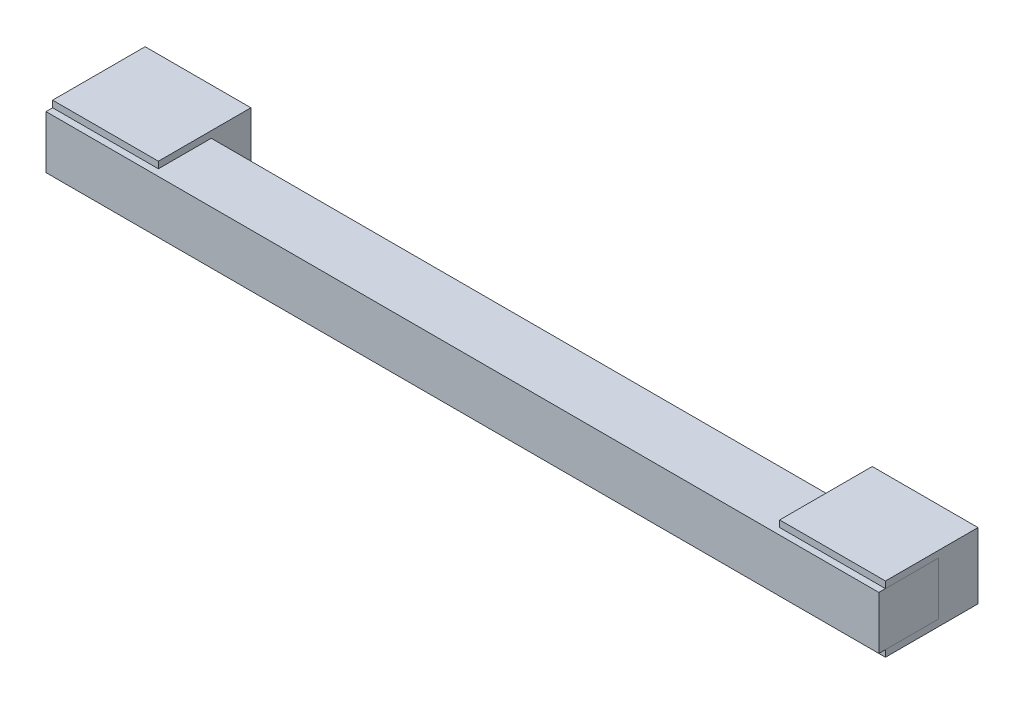
ISO-10303-21;
HEADER;
FILE_DESCRIPTION(('STEP AP214'),'2;1');
FILE_NAME('part.step','',(''),(''),'','','');
FILE_SCHEMA(('AUTOMOTIVE_DESIGN { 1 0 10303 214 1 1 1 1 }'));
ENDSEC;
DATA;
#1=APPLICATION_CONTEXT('core data for automotive mechanical design processes');
#2=APPLICATION_PROTOCOL_DEFINITION('international standard','automotive_design',2000,#1);
#3=PRODUCT_CONTEXT('',#1,'mechanical');
#4=PRODUCT('Part','Part','',(#3));
#5=PRODUCT_RELATED_PRODUCT_CATEGORY('part','',(#4));
#6=PRODUCT_DEFINITION_FORMATION('','',#4);
#7=PRODUCT_DEFINITION_CONTEXT('part definition',#1,'design');
#8=PRODUCT_DEFINITION('design','',#6,#7);
#9=PRODUCT_DEFINITION_SHAPE('','',#8);
#10=(LENGTH_UNIT() NAMED_UNIT(*) SI_UNIT(.MILLI.,.METRE.));
#11=(NAMED_UNIT(*) PLANE_ANGLE_UNIT() SI_UNIT($,.RADIAN.));
#12=(NAMED_UNIT(*) SI_UNIT($,.STERADIAN.) SOLID_ANGLE_UNIT());
#13=UNCERTAINTY_MEASURE_WITH_UNIT(LENGTH_MEASURE(1.E-05),#10,'distance_accuracy_value','');
#14=(GEOMETRIC_REPRESENTATION_CONTEXT(3) GLOBAL_UNCERTAINTY_ASSIGNED_CONTEXT((#13)) GLOBAL_UNIT_ASSIGNED_CONTEXT((#10,
#11,#12)) REPRESENTATION_CONTEXT('',''));
#15=CARTESIAN_POINT('',(0.,0.,0.));
#16=DIRECTION('',(0.,0.,1.));
#17=DIRECTION('',(1.,0.,0.));
#18=AXIS2_PLACEMENT_3D('',#15,#16,#17);
#19=CARTESIAN_POINT('',(0.,0.,15.));
#20=DIRECTION('',(0.,0.,1.));
#21=DIRECTION('',(1.,0.,0.));
#22=AXIS2_PLACEMENT_3D('',#19,#20,#21);
#23=PLANE('',#22);
#24=DIRECTION('',(-1.,0.,0.));
#25=VECTOR('',#24,1.);
#26=CARTESIAN_POINT('',(0.,-4.,15.));
#27=LINE('',#26,#25);
#28=CARTESIAN_POINT('',(63.,-4.,15.));
#29=VERTEX_POINT('',#28);
#30=CARTESIAN_POINT('',(-63.,-4.,15.));
#31=VERTEX_POINT('',#30);
#32=EDGE_CURVE('P0_E11',#29,#31,#27,.T.);
#33=ORIENTED_EDGE('',*,*,#32,.F.);
#34=DIRECTION('',(0.,-1.,0.));
#35=VECTOR('',#34,1.);
#36=CARTESIAN_POINT('',(63.,0.,15.));
#37=LINE('',#36,#35);
#38=CARTESIAN_POINT('',(63.,4.,15.));
#39=VERTEX_POINT('',#38);
#40=EDGE_CURVE('P0_E62',#39,#29,#37,.T.);
#41=ORIENTED_EDGE('',*,*,#40,.F.);
#42=DIRECTION('',(1.,0.,0.));
#43=VECTOR('',#42,1.);
#44=CARTESIAN_POINT('',(0.,4.,15.));
#45=LINE('',#44,#43);
#46=CARTESIAN_POINT('',(-63.,4.,15.));
#47=VERTEX_POINT('',#46);
#48=EDGE_CURVE('P0_E98',#47,#39,#45,.T.);
#49=ORIENTED_EDGE('',*,*,#48,.F.);
#50=DIRECTION('',(0.,1.,0.));
#51=VECTOR('',#50,1.);
#52=CARTESIAN_POINT('',(-63.,0.,15.));
#53=LINE('',#52,#51);
#54=EDGE_CURVE('P0_E25',#31,#47,#53,.T.);
#55=ORIENTED_EDGE('',*,*,#54,.F.);
#56=EDGE_LOOP('',(#33,#41,#49,#55));
#57=FACE_BOUND('',#56,.T.);
#58=ADVANCED_FACE('P0_F17',(#57),#23,.T.);
#59=CARTESIAN_POINT('',(0.,-4.,6.));
#60=DIRECTION('',(0.,-1.,0.));
#61=DIRECTION('',(0.,0.,-1.));
#62=AXIS2_PLACEMENT_3D('',#59,#60,#61);
#63=PLANE('',#62);
#64=DIRECTION('',(0.,0.,1.));
#65=VECTOR('',#64,1.);
#66=CARTESIAN_POINT('',(63.,-4.,6.));
#67=LINE('',#66,#65);
#68=CARTESIAN_POINT('',(63.,-4.,6.));
#69=VERTEX_POINT('',#68);
#70=EDGE_CURVE('P0_E55',#69,#29,#67,.T.);
#71=ORIENTED_EDGE('',*,*,#70,.T.);
#72=ORIENTED_EDGE('',*,*,#32,.T.);
#73=DIRECTION('',(0.,0.,1.));
#74=VECTOR('',#73,1.);
#75=CARTESIAN_POINT('',(-63.,-4.,6.));
#76=LINE('',#75,#74);
#77=CARTESIAN_POINT('',(-63.,-4.,6.));
#78=VERTEX_POINT('',#77);
#79=EDGE_CURVE('P0_E69',#78,#31,#76,.T.);
#80=ORIENTED_EDGE('',*,*,#79,.F.);
#81=DIRECTION('',(1.,0.,0.));
#82=VECTOR('',#81,1.);
#83=CARTESIAN_POINT('',(0.,-4.,6.));
#84=LINE('',#83,#82);
#85=EDGE_CURVE('P0_E67',#78,#69,#84,.T.);
#86=ORIENTED_EDGE('',*,*,#85,.T.);
#87=EDGE_LOOP('',(#71,#72,#80,#86));
#88=FACE_BOUND('',#87,.T.);
#89=ADVANCED_FACE('P0_F68',(#88),#63,.T.);
#90=CARTESIAN_POINT('',(-63.,0.,6.));
#91=DIRECTION('',(-1.,0.,0.));
#92=DIRECTION('',(0.,0.,1.));
#93=AXIS2_PLACEMENT_3D('',#90,#91,#92);
#94=PLANE('',#93);
#95=ORIENTED_EDGE('',*,*,#79,.T.);
#96=ORIENTED_EDGE('',*,*,#54,.T.);
#97=DIRECTION('',(0.,0.,1.));
#98=VECTOR('',#97,1.);
#99=CARTESIAN_POINT('',(-63.,4.,6.));
#100=LINE('',#99,#98);
#101=CARTESIAN_POINT('',(-63.,4.,6.));
#102=VERTEX_POINT('',#101);
#103=EDGE_CURVE('P0_E91',#102,#47,#100,.T.);
#104=ORIENTED_EDGE('',*,*,#103,.F.);
#105=DIRECTION('',(0.,-1.,0.));
#106=VECTOR('',#105,1.);
#107=CARTESIAN_POINT('',(-63.,0.,6.));
#108=LINE('',#107,#106);
#109=EDGE_CURVE('P0_E74',#102,#78,#108,.T.);
#110=ORIENTED_EDGE('',*,*,#109,.T.);
#111=EDGE_LOOP('',(#95,#96,#104,#110));
#112=FACE_BOUND('',#111,.T.);
#113=ADVANCED_FACE('P0_F106',(#112),#94,.T.);
#114=CARTESIAN_POINT('',(0.,4.,6.));
#115=DIRECTION('',(0.,1.,0.));
#116=DIRECTION('',(0.,0.,1.));
#117=AXIS2_PLACEMENT_3D('',#114,#115,#116);
#118=PLANE('',#117);
#119=ORIENTED_EDGE('',*,*,#103,.T.);
#120=ORIENTED_EDGE('',*,*,#48,.T.);
#121=DIRECTION('',(0.,0.,1.));
#122=VECTOR('',#121,1.);
#123=CARTESIAN_POINT('',(63.,4.,6.));
#124=LINE('',#123,#122);
#125=CARTESIAN_POINT('',(63.,4.,6.));
#126=VERTEX_POINT('',#125);
#127=EDGE_CURVE('P0_E64',#126,#39,#124,.T.);
#128=ORIENTED_EDGE('',*,*,#127,.F.);
#129=DIRECTION('',(-1.,0.,0.));
#130=VECTOR('',#129,1.);
#131=CARTESIAN_POINT('',(0.,4.,6.));
#132=LINE('',#131,#130);
#133=EDGE_CURVE('P0_E79',#126,#102,#132,.T.);
#134=ORIENTED_EDGE('',*,*,#133,.T.);
#135=EDGE_LOOP('',(#119,#120,#128,#134));
#136=FACE_BOUND('',#135,.T.);
#137=ADVANCED_FACE('P0_F104',(#136),#118,.T.);
#138=CARTESIAN_POINT('',(0.,0.,6.));
#139=DIRECTION('',(0.,0.,-1.));
#140=DIRECTION('',(-1.,0.,0.));
#141=AXIS2_PLACEMENT_3D('',#138,#139,#140);
#142=PLANE('',#141);
#143=DIRECTION('',(0.,1.,0.));
#144=VECTOR('',#143,1.);
#145=CARTESIAN_POINT('',(63.,0.,6.));
#146=LINE('',#145,#144);
#147=EDGE_CURVE('P0_E60',#69,#126,#146,.T.);
#148=ORIENTED_EDGE('',*,*,#147,.F.);
#149=ORIENTED_EDGE('',*,*,#85,.F.);
#150=ORIENTED_EDGE('',*,*,#109,.F.);
#151=ORIENTED_EDGE('',*,*,#133,.F.);
#152=EDGE_LOOP('',(#148,#149,#150,#151));
#153=FACE_BOUND('',#152,.T.);
#154=ADVANCED_FACE('P0_F77',(#153),#142,.T.);
#155=CARTESIAN_POINT('',(63.,0.,6.));
#156=DIRECTION('',(1.,0.,0.));
#157=DIRECTION('',(0.,0.,-1.));
#158=AXIS2_PLACEMENT_3D('',#155,#156,#157);
#159=PLANE('',#158);
#160=ORIENTED_EDGE('',*,*,#147,.T.);
#161=ORIENTED_EDGE('',*,*,#127,.T.);
#162=ORIENTED_EDGE('',*,*,#40,.T.);
#163=ORIENTED_EDGE('',*,*,#70,.F.);
#164=EDGE_LOOP('',(#160,#161,#162,#163));
#165=FACE_BOUND('',#164,.T.);
#166=ADVANCED_FACE('P0_F57',(#165),#159,.T.);
#167=CLOSED_SHELL('',(#58,#89,#113,#137,#154,#166));
#168=MANIFOLD_SOLID_BREP('P0_B1',#167);
#169=CARTESIAN_POINT('',(-55.,0.,14.));
#170=DIRECTION('',(0.,0.,1.));
#171=DIRECTION('',(1.,0.,0.));
#172=AXIS2_PLACEMENT_3D('',#169,#170,#171);
#173=PLANE('',#172);
#174=DIRECTION('',(-1.,0.,0.));
#175=VECTOR('',#174,1.);
#176=CARTESIAN_POINT('',(-55.,-5.,14.));
#177=LINE('',#176,#175);
#178=CARTESIAN_POINT('',(-47.,-5.,14.));
#179=VERTEX_POINT('',#178);
#180=CARTESIAN_POINT('',(-63.,-5.,14.));
#181=VERTEX_POINT('',#180);
#182=EDGE_CURVE('P1_E11',#179,#181,#177,.T.);
#183=ORIENTED_EDGE('',*,*,#182,.F.);
#184=DIRECTION('',(0.,-1.,0.));
#185=VECTOR('',#184,1.);
#186=CARTESIAN_POINT('',(-47.,0.,14.));
#187=LINE('',#186,#185);
#188=CARTESIAN_POINT('',(-47.,5.,14.));
#189=VERTEX_POINT('',#188);
#190=EDGE_CURVE('P1_E62',#189,#179,#187,.T.);
#191=ORIENTED_EDGE('',*,*,#190,.F.);
#192=DIRECTION('',(1.,0.,0.));
#193=VECTOR('',#192,1.);
#194=CARTESIAN_POINT('',(-55.,5.,14.));
#195=LINE('',#194,#193);
#196=CARTESIAN_POINT('',(-63.,5.,14.));
#197=VERTEX_POINT('',#196);
#198=EDGE_CURVE('P1_E99',#197,#189,#195,.T.);
#199=ORIENTED_EDGE('',*,*,#198,.F.);
#200=DIRECTION('',(0.,1.,0.));
#201=VECTOR('',#200,1.);
#202=CARTESIAN_POINT('',(-63.,0.,14.));
#203=LINE('',#202,#201);
#204=EDGE_CURVE('P1_E25',#181,#197,#203,.T.);
#205=ORIENTED_EDGE('',*,*,#204,.F.);
#206=EDGE_LOOP('',(#183,#191,#199,#205));
#207=FACE_BOUND('',#206,.T.);
#208=ADVANCED_FACE('P1_F17',(#207),#173,.T.);
#209=CARTESIAN_POINT('',(-55.,-5.,0.));
#210=DIRECTION('',(0.,-1.,0.));
#211=DIRECTION('',(0.,0.,-1.));
#212=AXIS2_PLACEMENT_3D('',#209,#210,#211);
#213=PLANE('',#212);
#214=DIRECTION('',(0.,0.,1.));
#215=VECTOR('',#214,1.);
#216=CARTESIAN_POINT('',(-47.,-5.,0.));
#217=LINE('',#216,#215);
#218=CARTESIAN_POINT('',(-47.,-5.,0.));
#219=VERTEX_POINT('',#218);
#220=EDGE_CURVE('P1_E55',#219,#179,#217,.T.);
#221=ORIENTED_EDGE('',*,*,#220,.T.);
#222=ORIENTED_EDGE('',*,*,#182,.T.);
#223=DIRECTION('',(0.,0.,1.));
#224=VECTOR('',#223,1.);
#225=CARTESIAN_POINT('',(-63.,-5.,0.));
#226=LINE('',#225,#224);
#227=CARTESIAN_POINT('',(-63.,-5.,0.));
#228=VERTEX_POINT('',#227);
#229=EDGE_CURVE('P1_E69',#228,#181,#226,.T.);
#230=ORIENTED_EDGE('',*,*,#229,.F.);
#231=DIRECTION('',(1.,0.,0.));
#232=VECTOR('',#231,1.);
#233=CARTESIAN_POINT('',(-55.,-5.,0.));
#234=LINE('',#233,#232);
#235=EDGE_CURVE('P1_E67',#228,#219,#234,.T.);
#236=ORIENTED_EDGE('',*,*,#235,.T.);
#237=EDGE_LOOP('',(#221,#222,#230,#236));
#238=FACE_BOUND('',#237,.T.);
#239=ADVANCED_FACE('P1_F68',(#238),#213,.T.);
#240=CARTESIAN_POINT('',(-63.,0.,0.));
#241=DIRECTION('',(-1.,0.,0.));
#242=DIRECTION('',(0.,0.,1.));
#243=AXIS2_PLACEMENT_3D('',#240,#241,#242);
#244=PLANE('',#243);
#245=ORIENTED_EDGE('',*,*,#229,.T.);
#246=ORIENTED_EDGE('',*,*,#204,.T.);
#247=DIRECTION('',(0.,0.,1.));
#248=VECTOR('',#247,1.);
#249=CARTESIAN_POINT('',(-63.,5.,0.));
#250=LINE('',#249,#248);
#251=CARTESIAN_POINT('',(-63.,5.,0.));
#252=VERTEX_POINT('',#251);
#253=EDGE_CURVE('P1_E92',#252,#197,#250,.T.);
#254=ORIENTED_EDGE('',*,*,#253,.F.);
#255=DIRECTION('',(0.,-1.,0.));
#256=VECTOR('',#255,1.);
#257=CARTESIAN_POINT('',(-63.,0.,0.));
#258=LINE('',#257,#256);
#259=EDGE_CURVE('P1_E74',#252,#228,#258,.T.);
#260=ORIENTED_EDGE('',*,*,#259,.T.);
#261=EDGE_LOOP('',(#245,#246,#254,#260));
#262=FACE_BOUND('',#261,.T.);
#263=ADVANCED_FACE('P1_F106',(#262),#244,.T.);
#264=CARTESIAN_POINT('',(-55.,5.,0.));
#265=DIRECTION('',(0.,1.,0.));
#266=DIRECTION('',(0.,0.,1.));
#267=AXIS2_PLACEMENT_3D('',#264,#265,#266);
#268=PLANE('',#267);
#269=ORIENTED_EDGE('',*,*,#253,.T.);
#270=ORIENTED_EDGE('',*,*,#198,.T.);
#271=DIRECTION('',(0.,0.,1.));
#272=VECTOR('',#271,1.);
#273=CARTESIAN_POINT('',(-47.,5.,0.));
#274=LINE('',#273,#272);
#275=CARTESIAN_POINT('',(-47.,5.,0.));
#276=VERTEX_POINT('',#275);
#277=EDGE_CURVE('P1_E64',#276,#189,#274,.T.);
#278=ORIENTED_EDGE('',*,*,#277,.F.);
#279=DIRECTION('',(-1.,0.,0.));
#280=VECTOR('',#279,1.);
#281=CARTESIAN_POINT('',(-55.,5.,0.));
#282=LINE('',#281,#280);
#283=EDGE_CURVE('P1_E79',#276,#252,#282,.T.);
#284=ORIENTED_EDGE('',*,*,#283,.T.);
#285=EDGE_LOOP('',(#269,#270,#278,#284));
#286=FACE_BOUND('',#285,.T.);
#287=ADVANCED_FACE('P1_F104',(#286),#268,.T.);
#288=CARTESIAN_POINT('',(-55.,0.,0.));
#289=DIRECTION('',(0.,0.,-1.));
#290=DIRECTION('',(-1.,0.,0.));
#291=AXIS2_PLACEMENT_3D('',#288,#289,#290);
#292=PLANE('',#291);
#293=DIRECTION('',(0.,1.,0.));
#294=VECTOR('',#293,1.);
#295=CARTESIAN_POINT('',(-47.,0.,0.));
#296=LINE('',#295,#294);
#297=EDGE_CURVE('P1_E60',#219,#276,#296,.T.);
#298=ORIENTED_EDGE('',*,*,#297,.F.);
#299=ORIENTED_EDGE('',*,*,#235,.F.);
#300=ORIENTED_EDGE('',*,*,#259,.F.);
#301=ORIENTED_EDGE('',*,*,#283,.F.);
#302=EDGE_LOOP('',(#298,#299,#300,#301));
#303=FACE_BOUND('',#302,.T.);
#304=ADVANCED_FACE('P1_F77',(#303),#292,.T.);
#305=CARTESIAN_POINT('',(-47.,0.,0.));
#306=DIRECTION('',(1.,0.,0.));
#307=DIRECTION('',(0.,0.,-1.));
#308=AXIS2_PLACEMENT_3D('',#305,#306,#307);
#309=PLANE('',#308);
#310=ORIENTED_EDGE('',*,*,#297,.T.);
#311=ORIENTED_EDGE('',*,*,#277,.T.);
#312=ORIENTED_EDGE('',*,*,#190,.T.);
#313=ORIENTED_EDGE('',*,*,#220,.F.);
#314=EDGE_LOOP('',(#310,#311,#312,#313));
#315=FACE_BOUND('',#314,.T.);
#316=ADVANCED_FACE('P1_F57',(#315),#309,.T.);
#317=CLOSED_SHELL('',(#208,#239,#263,#287,#304,#316));
#318=MANIFOLD_SOLID_BREP('P1_B1',#317);
#319=CARTESIAN_POINT('',(55.,0.,14.));
#320=DIRECTION('',(0.,0.,1.));
#321=DIRECTION('',(1.,0.,0.));
#322=AXIS2_PLACEMENT_3D('',#319,#320,#321);
#323=PLANE('',#322);
#324=DIRECTION('',(-1.,0.,0.));
#325=VECTOR('',#324,1.);
#326=CARTESIAN_POINT('',(55.,-5.,14.));
#327=LINE('',#326,#325);
#328=CARTESIAN_POINT('',(63.,-5.,14.));
#329=VERTEX_POINT('',#328);
#330=CARTESIAN_POINT('',(47.,-5.,14.));
#331=VERTEX_POINT('',#330);
#332=EDGE_CURVE('P2_E10',#329,#331,#327,.T.);
#333=ORIENTED_EDGE('',*,*,#332,.F.);
#334=DIRECTION('',(0.,-1.,0.));
#335=VECTOR('',#334,1.);
#336=CARTESIAN_POINT('',(63.,0.,14.));
#337=LINE('',#336,#335);
#338=CARTESIAN_POINT('',(63.,5.,14.));
#339=VERTEX_POINT('',#338);
#340=EDGE_CURVE('P2_E61',#339,#329,#337,.T.);
#341=ORIENTED_EDGE('',*,*,#340,.F.);
#342=DIRECTION('',(1.,0.,0.));
#343=VECTOR('',#342,1.);
#344=CARTESIAN_POINT('',(55.,5.,14.));
#345=LINE('',#344,#343);
#346=CARTESIAN_POINT('',(47.,5.,14.));
#347=VERTEX_POINT('',#346);
#348=EDGE_CURVE('P2_E97',#347,#339,#345,.T.);
#349=ORIENTED_EDGE('',*,*,#348,.F.);
#350=DIRECTION('',(0.,1.,0.));
#351=VECTOR('',#350,1.);
#352=CARTESIAN_POINT('',(47.,0.,14.));
#353=LINE('',#352,#351);
#354=EDGE_CURVE('P2_E24',#331,#347,#353,.T.);
#355=ORIENTED_EDGE('',*,*,#354,.F.);
#356=EDGE_LOOP('',(#333,#341,#349,#355));
#357=FACE_BOUND('',#356,.T.);
#358=ADVANCED_FACE('P2_F16',(#357),#323,.T.);
#359=CARTESIAN_POINT('',(55.,-5.,0.));
#360=DIRECTION('',(0.,-1.,0.));
#361=DIRECTION('',(0.,0.,-1.));
#362=AXIS2_PLACEMENT_3D('',#359,#360,#361);
#363=PLANE('',#362);
#364=DIRECTION('',(0.,0.,1.));
#365=VECTOR('',#364,1.);
#366=CARTESIAN_POINT('',(63.,-5.,0.));
#367=LINE('',#366,#365);
#368=CARTESIAN_POINT('',(63.,-5.,0.));
#369=VERTEX_POINT('',#368);
#370=EDGE_CURVE('P2_E54',#369,#329,#367,.T.);
#371=ORIENTED_EDGE('',*,*,#370,.T.);
#372=ORIENTED_EDGE('',*,*,#332,.T.);
#373=DIRECTION('',(0.,0.,1.));
#374=VECTOR('',#373,1.);
#375=CARTESIAN_POINT('',(47.,-5.,0.));
#376=LINE('',#375,#374);
#377=CARTESIAN_POINT('',(47.,-5.,0.));
#378=VERTEX_POINT('',#377);
#379=EDGE_CURVE('P2_E68',#378,#331,#376,.T.);
#380=ORIENTED_EDGE('',*,*,#379,.F.);
#381=DIRECTION('',(1.,0.,0.));
#382=VECTOR('',#381,1.);
#383=CARTESIAN_POINT('',(55.,-5.,0.));
#384=LINE('',#383,#382);
#385=EDGE_CURVE('P2_E66',#378,#369,#384,.T.);
#386=ORIENTED_EDGE('',*,*,#385,.T.);
#387=EDGE_LOOP('',(#371,#372,#380,#386));
#388=FACE_BOUND('',#387,.T.);
#389=ADVANCED_FACE('P2_F67',(#388),#363,.T.);
#390=CARTESIAN_POINT('',(47.,0.,0.));
#391=DIRECTION('',(-1.,0.,0.));
#392=DIRECTION('',(0.,0.,1.));
#393=AXIS2_PLACEMENT_3D('',#390,#391,#392);
#394=PLANE('',#393);
#395=ORIENTED_EDGE('',*,*,#379,.T.);
#396=ORIENTED_EDGE('',*,*,#354,.T.);
#397=DIRECTION('',(0.,0.,1.));
#398=VECTOR('',#397,1.);
#399=CARTESIAN_POINT('',(47.,5.,0.));
#400=LINE('',#399,#398);
#401=CARTESIAN_POINT('',(47.,5.,0.));
#402=VERTEX_POINT('',#401);
#403=EDGE_CURVE('P2_E90',#402,#347,#400,.T.);
#404=ORIENTED_EDGE('',*,*,#403,.F.);
#405=DIRECTION('',(0.,-1.,0.));
#406=VECTOR('',#405,1.);
#407=CARTESIAN_POINT('',(47.,0.,0.));
#408=LINE('',#407,#406);
#409=EDGE_CURVE('P2_E73',#402,#378,#408,.T.);
#410=ORIENTED_EDGE('',*,*,#409,.T.);
#411=EDGE_LOOP('',(#395,#396,#404,#410));
#412=FACE_BOUND('',#411,.T.);
#413=ADVANCED_FACE('P2_F105',(#412),#394,.T.);
#414=CARTESIAN_POINT('',(55.,5.,0.));
#415=DIRECTION('',(0.,1.,0.));
#416=DIRECTION('',(0.,0.,1.));
#417=AXIS2_PLACEMENT_3D('',#414,#415,#416);
#418=PLANE('',#417);
#419=ORIENTED_EDGE('',*,*,#403,.T.);
#420=ORIENTED_EDGE('',*,*,#348,.T.);
#421=DIRECTION('',(0.,0.,1.));
#422=VECTOR('',#421,1.);
#423=CARTESIAN_POINT('',(63.,5.,0.));
#424=LINE('',#423,#422);
#425=CARTESIAN_POINT('',(63.,5.,0.));
#426=VERTEX_POINT('',#425);
#427=EDGE_CURVE('P2_E63',#426,#339,#424,.T.);
#428=ORIENTED_EDGE('',*,*,#427,.F.);
#429=DIRECTION('',(-1.,0.,0.));
#430=VECTOR('',#429,1.);
#431=CARTESIAN_POINT('',(55.,5.,0.));
#432=LINE('',#431,#430);
#433=EDGE_CURVE('P2_E78',#426,#402,#432,.T.);
#434=ORIENTED_EDGE('',*,*,#433,.T.);
#435=EDGE_LOOP('',(#419,#420,#428,#434));
#436=FACE_BOUND('',#435,.T.);
#437=ADVANCED_FACE('P2_F103',(#436),#418,.T.);
#438=CARTESIAN_POINT('',(55.,0.,0.));
#439=DIRECTION('',(0.,0.,-1.));
#440=DIRECTION('',(-1.,0.,0.));
#441=AXIS2_PLACEMENT_3D('',#438,#439,#440);
#442=PLANE('',#441);
#443=DIRECTION('',(0.,1.,0.));
#444=VECTOR('',#443,1.);
#445=CARTESIAN_POINT('',(63.,0.,0.));
#446=LINE('',#445,#444);
#447=EDGE_CURVE('P2_E59',#369,#426,#446,.T.);
#448=ORIENTED_EDGE('',*,*,#447,.F.);
#449=ORIENTED_EDGE('',*,*,#385,.F.);
#450=ORIENTED_EDGE('',*,*,#409,.F.);
#451=ORIENTED_EDGE('',*,*,#433,.F.);
#452=EDGE_LOOP('',(#448,#449,#450,#451));
#453=FACE_BOUND('',#452,.T.);
#454=ADVANCED_FACE('P2_F76',(#453),#442,.T.);
#455=CARTESIAN_POINT('',(63.,0.,0.));
#456=DIRECTION('',(1.,0.,0.));
#457=DIRECTION('',(0.,0.,-1.));
#458=AXIS2_PLACEMENT_3D('',#455,#456,#457);
#459=PLANE('',#458);
#460=ORIENTED_EDGE('',*,*,#447,.T.);
#461=ORIENTED_EDGE('',*,*,#427,.T.);
#462=ORIENTED_EDGE('',*,*,#340,.T.);
#463=ORIENTED_EDGE('',*,*,#370,.F.);
#464=EDGE_LOOP('',(#460,#461,#462,#463));
#465=FACE_BOUND('',#464,.T.);
#466=ADVANCED_FACE('P2_F56',(#465),#459,.T.);
#467=CLOSED_SHELL('',(#358,#389,#413,#437,#454,#466));
#468=MANIFOLD_SOLID_BREP('P2_B1',#467);
#469=ADVANCED_BREP_SHAPE_REPRESENTATION('',(#18,#168,#318,#468),#14);
#470=SHAPE_DEFINITION_REPRESENTATION(#9,#469);
ENDSEC;
END-ISO-10303-21;
